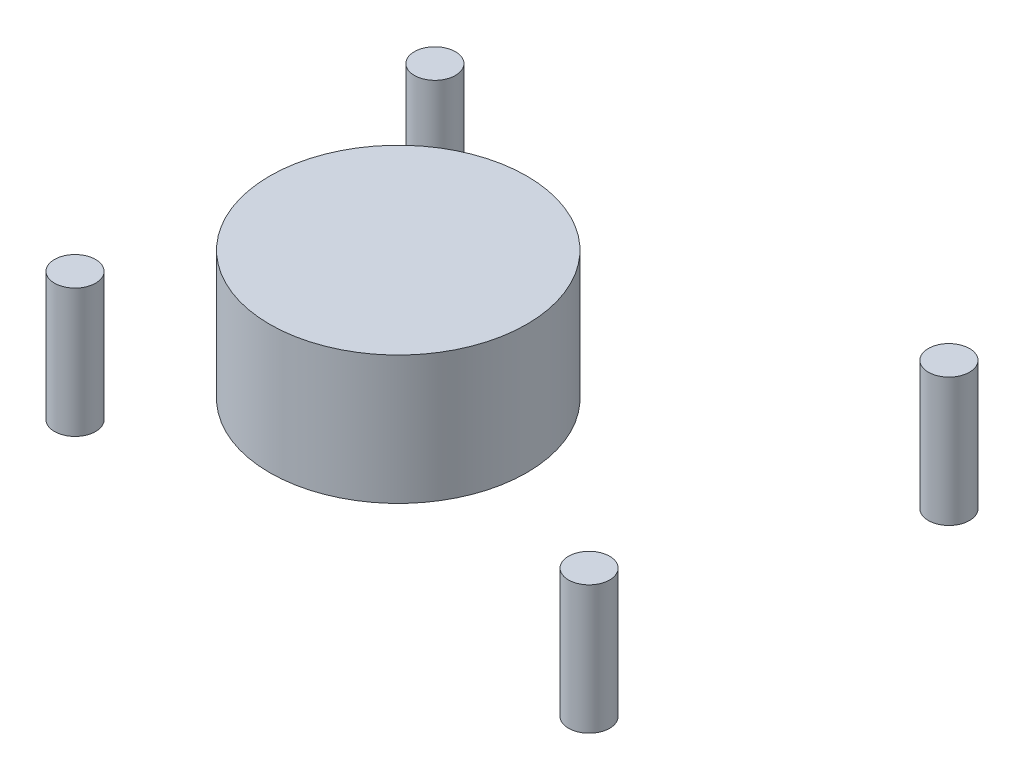
ISO-10303-21;
HEADER;
FILE_DESCRIPTION(('STEP AP214'),'2;1');
FILE_NAME('part.step','',(''),(''),'','','');
FILE_SCHEMA(('AUTOMOTIVE_DESIGN { 1 0 10303 214 1 1 1 1 }'));
ENDSEC;
DATA;
#1=APPLICATION_CONTEXT('core data for automotive mechanical design processes');
#2=APPLICATION_PROTOCOL_DEFINITION('international standard','automotive_design',2000,#1);
#3=PRODUCT_CONTEXT('',#1,'mechanical');
#4=PRODUCT('Part','Part','',(#3));
#5=PRODUCT_RELATED_PRODUCT_CATEGORY('part','',(#4));
#6=PRODUCT_DEFINITION_FORMATION('','',#4);
#7=PRODUCT_DEFINITION_CONTEXT('part definition',#1,'design');
#8=PRODUCT_DEFINITION('design','',#6,#7);
#9=PRODUCT_DEFINITION_SHAPE('','',#8);
#10=(LENGTH_UNIT() NAMED_UNIT(*) SI_UNIT(.MILLI.,.METRE.));
#11=(NAMED_UNIT(*) PLANE_ANGLE_UNIT() SI_UNIT($,.RADIAN.));
#12=(NAMED_UNIT(*) SI_UNIT($,.STERADIAN.) SOLID_ANGLE_UNIT());
#13=UNCERTAINTY_MEASURE_WITH_UNIT(LENGTH_MEASURE(1.E-05),#10,'distance_accuracy_value','');
#14=(GEOMETRIC_REPRESENTATION_CONTEXT(3) GLOBAL_UNCERTAINTY_ASSIGNED_CONTEXT((#13)) GLOBAL_UNIT_ASSIGNED_CONTEXT((#10,
#11,#12)) REPRESENTATION_CONTEXT('',''));
#15=CARTESIAN_POINT('',(0.,0.,0.));
#16=DIRECTION('',(0.,0.,1.));
#17=DIRECTION('',(1.,0.,0.));
#18=AXIS2_PLACEMENT_3D('',#15,#16,#17);
#19=CARTESIAN_POINT('',(60.1796378992842,10.,-10.1083858021225));
#20=DIRECTION('',(0.,-1.,0.));
#21=DIRECTION('',(0.,0.,-1.));
#22=AXIS2_PLACEMENT_3D('',#19,#20,#21);
#23=CYLINDRICAL_SURFACE('',#22,1.6);
#24=CARTESIAN_POINT('',(60.1796378992842,10.,-10.1083858021225));
#25=DIRECTION('',(0.,1.,0.));
#26=DIRECTION('',(0.,0.,1.));
#27=AXIS2_PLACEMENT_3D('',#24,#25,#26);
#28=CIRCLE('',#27,1.6);
#29=CARTESIAN_POINT('',(60.1796378992842,10.,-8.50838580212254));
#30=VERTEX_POINT('',#29);
#31=EDGE_CURVE('E50',#30,#30,#28,.T.);
#32=ORIENTED_EDGE('',*,*,#31,.F.);
#33=EDGE_LOOP('',(#32));
#34=FACE_BOUND('',#33,.T.);
#35=CARTESIAN_POINT('',(60.1796378992842,0.,-10.1083858021225));
#36=DIRECTION('',(0.,1.,0.));
#37=DIRECTION('',(0.,0.,1.));
#38=AXIS2_PLACEMENT_3D('',#35,#36,#37);
#39=CIRCLE('',#38,1.6);
#40=CARTESIAN_POINT('',(60.1796378992842,0.,-8.50838580212254));
#41=VERTEX_POINT('',#40);
#42=EDGE_CURVE('E11',#41,#41,#39,.T.);
#43=ORIENTED_EDGE('',*,*,#42,.T.);
#44=EDGE_LOOP('',(#43));
#45=FACE_BOUND('',#44,.T.);
#46=ADVANCED_FACE('F46',(#34,#45),#23,.T.);
#47=CARTESIAN_POINT('',(60.1796378992842,10.,-10.1083858021225));
#48=DIRECTION('',(0.,1.,0.));
#49=DIRECTION('',(0.,0.,1.));
#50=AXIS2_PLACEMENT_3D('',#47,#48,#49);
#51=PLANE('',#50);
#52=ORIENTED_EDGE('',*,*,#31,.T.);
#53=EDGE_LOOP('',(#52));
#54=FACE_BOUND('',#53,.T.);
#55=ADVANCED_FACE('F48',(#54),#51,.T.);
#56=CARTESIAN_POINT('',(60.1796378992842,0.,-10.1083858021225));
#57=DIRECTION('',(0.,1.,0.));
#58=DIRECTION('',(0.,0.,1.));
#59=AXIS2_PLACEMENT_3D('',#56,#57,#58);
#60=PLANE('',#59);
#61=ORIENTED_EDGE('',*,*,#42,.F.);
#62=EDGE_LOOP('',(#61));
#63=FACE_BOUND('',#62,.T.);
#64=ADVANCED_FACE('F65',(#63),#60,.F.);
#65=CLOSED_SHELL('',(#46,#55,#64));
#66=MANIFOLD_SOLID_BREP('B2',#65);
#67=CARTESIAN_POINT('',(60.1796378992842,10.,-38.1083858021225));
#68=DIRECTION('',(0.,-1.,0.));
#69=DIRECTION('',(0.,0.,-1.));
#70=AXIS2_PLACEMENT_3D('',#67,#68,#69);
#71=CYLINDRICAL_SURFACE('',#70,1.6);
#72=CARTESIAN_POINT('',(60.1796378992842,10.,-38.1083858021225));
#73=DIRECTION('',(0.,1.,0.));
#74=DIRECTION('',(0.,0.,1.));
#75=AXIS2_PLACEMENT_3D('',#72,#73,#74);
#76=CIRCLE('',#75,1.6);
#77=CARTESIAN_POINT('',(60.1796378992842,10.,-36.5083858021225));
#78=VERTEX_POINT('',#77);
#79=EDGE_CURVE('E99',#78,#78,#76,.T.);
#80=ORIENTED_EDGE('',*,*,#79,.F.);
#81=EDGE_LOOP('',(#80));
#82=FACE_BOUND('',#81,.T.);
#83=CARTESIAN_POINT('',(60.1796378992842,0.,-38.1083858021225));
#84=DIRECTION('',(0.,1.,0.));
#85=DIRECTION('',(0.,0.,1.));
#86=AXIS2_PLACEMENT_3D('',#83,#84,#85);
#87=CIRCLE('',#86,1.6);
#88=CARTESIAN_POINT('',(60.1796378992842,0.,-36.5083858021225));
#89=VERTEX_POINT('',#88);
#90=EDGE_CURVE('E45',#89,#89,#87,.T.);
#91=ORIENTED_EDGE('',*,*,#90,.T.);
#92=EDGE_LOOP('',(#91));
#93=FACE_BOUND('',#92,.T.);
#94=ADVANCED_FACE('F95',(#82,#93),#71,.T.);
#95=CARTESIAN_POINT('',(60.1796378992842,10.,-38.1083858021225));
#96=DIRECTION('',(0.,1.,0.));
#97=DIRECTION('',(0.,0.,1.));
#98=AXIS2_PLACEMENT_3D('',#95,#96,#97);
#99=PLANE('',#98);
#100=ORIENTED_EDGE('',*,*,#79,.T.);
#101=EDGE_LOOP('',(#100));
#102=FACE_BOUND('',#101,.T.);
#103=ADVANCED_FACE('F97',(#102),#99,.T.);
#104=CARTESIAN_POINT('',(60.1796378992842,0.,-38.1083858021225));
#105=DIRECTION('',(0.,1.,0.));
#106=DIRECTION('',(0.,0.,1.));
#107=AXIS2_PLACEMENT_3D('',#104,#105,#106);
#108=PLANE('',#107);
#109=ORIENTED_EDGE('',*,*,#90,.F.);
#110=EDGE_LOOP('',(#109));
#111=FACE_BOUND('',#110,.T.);
#112=ADVANCED_FACE('F114',(#111),#108,.F.);
#113=CLOSED_SHELL('',(#94,#103,#112));
#114=MANIFOLD_SOLID_BREP('B6',#113);
#115=CARTESIAN_POINT('',(31.3296378992842,10.,-24.1083858021225));
#116=DIRECTION('',(0.,-1.,0.));
#117=DIRECTION('',(0.,0.,-1.));
#118=AXIS2_PLACEMENT_3D('',#115,#116,#117);
#119=CYLINDRICAL_SURFACE('',#118,10.);
#120=CARTESIAN_POINT('',(31.3296378992842,10.,-24.1083858021225));
#121=DIRECTION('',(0.,1.,0.));
#122=DIRECTION('',(0.,0.,1.));
#123=AXIS2_PLACEMENT_3D('',#120,#121,#122);
#124=CIRCLE('',#123,10.);
#125=CARTESIAN_POINT('',(31.3296378992842,10.,-14.1083858021225));
#126=VERTEX_POINT('',#125);
#127=EDGE_CURVE('E148',#126,#126,#124,.T.);
#128=ORIENTED_EDGE('',*,*,#127,.F.);
#129=EDGE_LOOP('',(#128));
#130=FACE_BOUND('',#129,.T.);
#131=CARTESIAN_POINT('',(31.3296378992842,0.,-24.1083858021225));
#132=DIRECTION('',(0.,1.,0.));
#133=DIRECTION('',(0.,0.,1.));
#134=AXIS2_PLACEMENT_3D('',#131,#132,#133);
#135=CIRCLE('',#134,10.);
#136=CARTESIAN_POINT('',(31.3296378992842,0.,-14.1083858021225));
#137=VERTEX_POINT('',#136);
#138=EDGE_CURVE('E94',#137,#137,#135,.T.);
#139=ORIENTED_EDGE('',*,*,#138,.T.);
#140=EDGE_LOOP('',(#139));
#141=FACE_BOUND('',#140,.T.);
#142=ADVANCED_FACE('F144',(#130,#141),#119,.T.);
#143=CARTESIAN_POINT('',(31.3296378992842,10.,-24.1083858021225));
#144=DIRECTION('',(0.,1.,0.));
#145=DIRECTION('',(0.,0.,1.));
#146=AXIS2_PLACEMENT_3D('',#143,#144,#145);
#147=PLANE('',#146);
#148=ORIENTED_EDGE('',*,*,#127,.T.);
#149=EDGE_LOOP('',(#148));
#150=FACE_BOUND('',#149,.T.);
#151=ADVANCED_FACE('F146',(#150),#147,.T.);
#152=CARTESIAN_POINT('',(31.3296378992842,0.,-24.1083858021225));
#153=DIRECTION('',(0.,1.,0.));
#154=DIRECTION('',(0.,0.,1.));
#155=AXIS2_PLACEMENT_3D('',#152,#153,#154);
#156=PLANE('',#155);
#157=ORIENTED_EDGE('',*,*,#138,.F.);
#158=EDGE_LOOP('',(#157));
#159=FACE_BOUND('',#158,.T.);
#160=ADVANCED_FACE('F165',(#159),#156,.F.);
#161=CLOSED_SHELL('',(#142,#151,#160));
#162=MANIFOLD_SOLID_BREP('B40',#161);
#163=CARTESIAN_POINT('',(20.1796378992842,10.,-10.1083858021225));
#164=DIRECTION('',(0.,-1.,0.));
#165=DIRECTION('',(0.,0.,-1.));
#166=AXIS2_PLACEMENT_3D('',#163,#164,#165);
#167=CYLINDRICAL_SURFACE('',#166,1.6);
#168=CARTESIAN_POINT('',(20.1796378992842,10.,-10.1083858021225));
#169=DIRECTION('',(0.,1.,0.));
#170=DIRECTION('',(0.,0.,1.));
#171=AXIS2_PLACEMENT_3D('',#168,#169,#170);
#172=CIRCLE('',#171,1.6);
#173=CARTESIAN_POINT('',(20.1796378992842,10.,-8.50838580212253));
#174=VERTEX_POINT('',#173);
#175=EDGE_CURVE('E198',#174,#174,#172,.T.);
#176=ORIENTED_EDGE('',*,*,#175,.F.);
#177=EDGE_LOOP('',(#176));
#178=FACE_BOUND('',#177,.T.);
#179=CARTESIAN_POINT('',(20.1796378992842,0.,-10.1083858021225));
#180=DIRECTION('',(0.,1.,0.));
#181=DIRECTION('',(0.,0.,1.));
#182=AXIS2_PLACEMENT_3D('',#179,#180,#181);
#183=CIRCLE('',#182,1.6);
#184=CARTESIAN_POINT('',(20.1796378992842,0.,-8.50838580212253));
#185=VERTEX_POINT('',#184);
#186=EDGE_CURVE('E143',#185,#185,#183,.T.);
#187=ORIENTED_EDGE('',*,*,#186,.T.);
#188=EDGE_LOOP('',(#187));
#189=FACE_BOUND('',#188,.T.);
#190=ADVANCED_FACE('F194',(#178,#189),#167,.T.);
#191=CARTESIAN_POINT('',(20.1796378992842,10.,-10.1083858021225));
#192=DIRECTION('',(0.,1.,0.));
#193=DIRECTION('',(0.,0.,1.));
#194=AXIS2_PLACEMENT_3D('',#191,#192,#193);
#195=PLANE('',#194);
#196=ORIENTED_EDGE('',*,*,#175,.T.);
#197=EDGE_LOOP('',(#196));
#198=FACE_BOUND('',#197,.T.);
#199=ADVANCED_FACE('F196',(#198),#195,.T.);
#200=CARTESIAN_POINT('',(20.1796378992842,0.,-10.1083858021225));
#201=DIRECTION('',(0.,1.,0.));
#202=DIRECTION('',(0.,0.,1.));
#203=AXIS2_PLACEMENT_3D('',#200,#201,#202);
#204=PLANE('',#203);
#205=ORIENTED_EDGE('',*,*,#186,.F.);
#206=EDGE_LOOP('',(#205));
#207=FACE_BOUND('',#206,.T.);
#208=ADVANCED_FACE('F213',(#207),#204,.F.);
#209=CLOSED_SHELL('',(#190,#199,#208));
#210=MANIFOLD_SOLID_BREP('B89',#209);
#211=CARTESIAN_POINT('',(20.1796378992842,10.,-38.1083858021225));
#212=DIRECTION('',(0.,-1.,0.));
#213=DIRECTION('',(0.,0.,-1.));
#214=AXIS2_PLACEMENT_3D('',#211,#212,#213);
#215=CYLINDRICAL_SURFACE('',#214,1.6);
#216=CARTESIAN_POINT('',(20.1796378992842,10.,-38.1083858021225));
#217=DIRECTION('',(0.,1.,0.));
#218=DIRECTION('',(0.,0.,1.));
#219=AXIS2_PLACEMENT_3D('',#216,#217,#218);
#220=CIRCLE('',#219,1.6);
#221=CARTESIAN_POINT('',(20.1796378992842,10.,-36.5083858021225));
#222=VERTEX_POINT('',#221);
#223=EDGE_CURVE('E193',#222,#222,#220,.T.);
#224=ORIENTED_EDGE('',*,*,#223,.F.);
#225=EDGE_LOOP('',(#224));
#226=FACE_BOUND('',#225,.T.);
#227=CARTESIAN_POINT('',(20.1796378992842,0.,-38.1083858021225));
#228=DIRECTION('',(0.,1.,0.));
#229=DIRECTION('',(0.,0.,1.));
#230=AXIS2_PLACEMENT_3D('',#227,#228,#229);
#231=CIRCLE('',#230,1.6);
#232=CARTESIAN_POINT('',(20.1796378992842,0.,-36.5083858021225));
#233=VERTEX_POINT('',#232);
#234=EDGE_CURVE('E238',#233,#233,#231,.T.);
#235=ORIENTED_EDGE('',*,*,#234,.T.);
#236=EDGE_LOOP('',(#235));
#237=FACE_BOUND('',#236,.T.);
#238=ADVANCED_FACE('F235',(#226,#237),#215,.T.);
#239=CARTESIAN_POINT('',(20.1796378992842,10.,-38.1083858021225));
#240=DIRECTION('',(0.,1.,0.));
#241=DIRECTION('',(0.,0.,1.));
#242=AXIS2_PLACEMENT_3D('',#239,#240,#241);
#243=PLANE('',#242);
#244=ORIENTED_EDGE('',*,*,#223,.T.);
#245=EDGE_LOOP('',(#244));
#246=FACE_BOUND('',#245,.T.);
#247=ADVANCED_FACE('F250',(#246),#243,.T.);
#248=CARTESIAN_POINT('',(20.1796378992842,0.,-38.1083858021225));
#249=DIRECTION('',(0.,1.,0.));
#250=DIRECTION('',(0.,0.,1.));
#251=AXIS2_PLACEMENT_3D('',#248,#249,#250);
#252=PLANE('',#251);
#253=ORIENTED_EDGE('',*,*,#234,.F.);
#254=EDGE_LOOP('',(#253));
#255=FACE_BOUND('',#254,.T.);
#256=ADVANCED_FACE('F248',(#255),#252,.F.);
#257=CLOSED_SHELL('',(#238,#247,#256));
#258=MANIFOLD_SOLID_BREP('B138',#257);
#259=ADVANCED_BREP_SHAPE_REPRESENTATION('',(#18,#66,#114,#162,#210,#258),#14);
#260=SHAPE_DEFINITION_REPRESENTATION(#9,#259);
ENDSEC;
END-ISO-10303-21;
